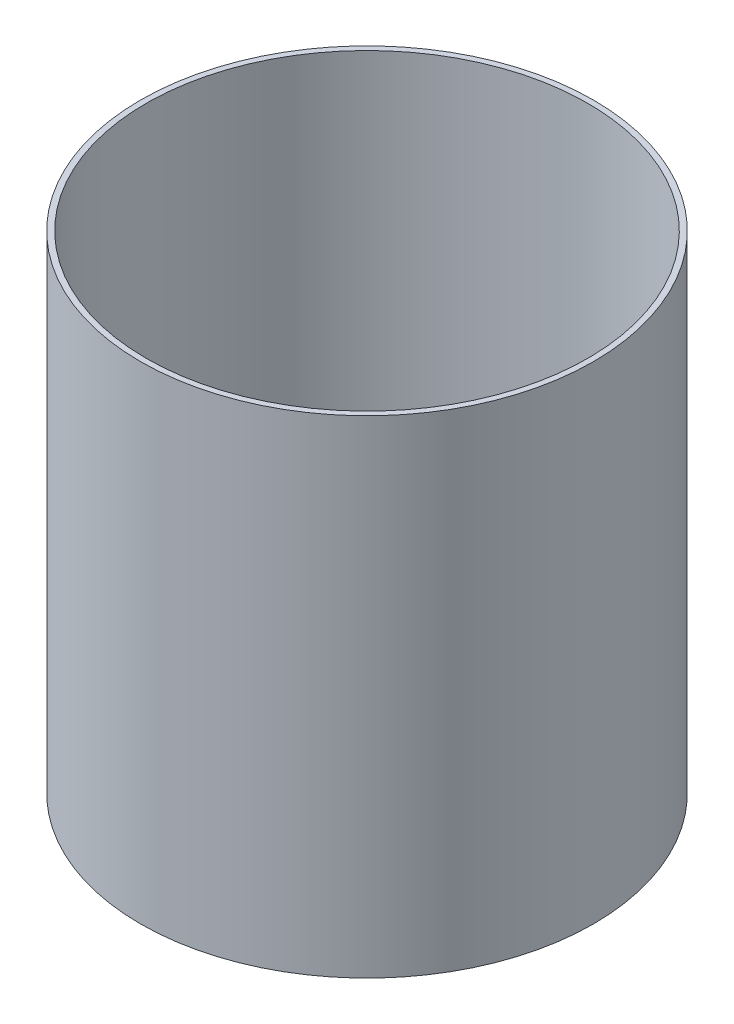
ISO-10303-21;
HEADER;
FILE_DESCRIPTION(('STEP AP214'),'2;1');
FILE_NAME('part.step','',(''),(''),'','','');
FILE_SCHEMA(('AUTOMOTIVE_DESIGN { 1 0 10303 214 1 1 1 1 }'));
ENDSEC;
DATA;
#1=APPLICATION_CONTEXT('core data for automotive mechanical design processes');
#2=APPLICATION_PROTOCOL_DEFINITION('international standard','automotive_design',2000,#1);
#3=PRODUCT_CONTEXT('',#1,'mechanical');
#4=PRODUCT('Part','Part','',(#3));
#5=PRODUCT_RELATED_PRODUCT_CATEGORY('part','',(#4));
#6=PRODUCT_DEFINITION_FORMATION('','',#4);
#7=PRODUCT_DEFINITION_CONTEXT('part definition',#1,'design');
#8=PRODUCT_DEFINITION('design','',#6,#7);
#9=PRODUCT_DEFINITION_SHAPE('','',#8);
#10=(LENGTH_UNIT() NAMED_UNIT(*) SI_UNIT(.MILLI.,.METRE.));
#11=(NAMED_UNIT(*) PLANE_ANGLE_UNIT() SI_UNIT($,.RADIAN.));
#12=(NAMED_UNIT(*) SI_UNIT($,.STERADIAN.) SOLID_ANGLE_UNIT());
#13=UNCERTAINTY_MEASURE_WITH_UNIT(LENGTH_MEASURE(1.E-05),#10,'distance_accuracy_value','');
#14=(GEOMETRIC_REPRESENTATION_CONTEXT(3) GLOBAL_UNCERTAINTY_ASSIGNED_CONTEXT((#13)) GLOBAL_UNIT_ASSIGNED_CONTEXT((#10,
#11,#12)) REPRESENTATION_CONTEXT('',''));
#15=CARTESIAN_POINT('',(0.,0.,0.));
#16=DIRECTION('',(0.,0.,1.));
#17=DIRECTION('',(1.,0.,0.));
#18=AXIS2_PLACEMENT_3D('',#15,#16,#17);
#19=CARTESIAN_POINT('',(0.,430.,0.));
#20=DIRECTION('',(0.,1.,0.));
#21=DIRECTION('',(0.,0.,1.));
#22=AXIS2_PLACEMENT_3D('',#19,#20,#21);
#23=PLANE('',#22);
#24=CARTESIAN_POINT('',(0.,430.,0.));
#25=DIRECTION('',(0.,1.,0.));
#26=DIRECTION('',(0.,0.,1.));
#27=AXIS2_PLACEMENT_3D('',#24,#25,#26);
#28=CIRCLE('',#27,200.);
#29=CARTESIAN_POINT('',(0.,430.,200.));
#30=VERTEX_POINT('',#29);
#31=EDGE_CURVE('E10',#30,#30,#28,.T.);
#32=ORIENTED_EDGE('',*,*,#31,.T.);
#33=EDGE_LOOP('',(#32));
#34=FACE_BOUND('',#33,.T.);
#35=CARTESIAN_POINT('',(0.,430.,0.));
#36=DIRECTION('',(0.,1.,0.));
#37=DIRECTION('',(0.,0.,1.));
#38=AXIS2_PLACEMENT_3D('',#35,#36,#37);
#39=CIRCLE('',#38,195.);
#40=CARTESIAN_POINT('',(0.,430.,195.));
#41=VERTEX_POINT('',#40);
#42=EDGE_CURVE('E52',#41,#41,#39,.T.);
#43=ORIENTED_EDGE('',*,*,#42,.F.);
#44=EDGE_LOOP('',(#43));
#45=FACE_BOUND('',#44,.T.);
#46=ADVANCED_FACE('F38',(#34,#45),#23,.T.);
#47=CARTESIAN_POINT('',(0.,0.,0.));
#48=DIRECTION('',(0.,1.,0.));
#49=DIRECTION('',(0.,0.,1.));
#50=AXIS2_PLACEMENT_3D('',#47,#48,#49);
#51=PLANE('',#50);
#52=CARTESIAN_POINT('',(0.,0.,0.));
#53=DIRECTION('',(0.,1.,0.));
#54=DIRECTION('',(0.,0.,1.));
#55=AXIS2_PLACEMENT_3D('',#52,#53,#54);
#56=CIRCLE('',#55,200.);
#57=CARTESIAN_POINT('',(0.,0.,200.));
#58=VERTEX_POINT('',#57);
#59=EDGE_CURVE('E42',#58,#58,#56,.T.);
#60=ORIENTED_EDGE('',*,*,#59,.F.);
#61=EDGE_LOOP('',(#60));
#62=FACE_BOUND('',#61,.T.);
#63=CARTESIAN_POINT('',(0.,0.,0.));
#64=DIRECTION('',(0.,1.,0.));
#65=DIRECTION('',(0.,0.,1.));
#66=AXIS2_PLACEMENT_3D('',#63,#64,#65);
#67=CIRCLE('',#66,195.);
#68=CARTESIAN_POINT('',(0.,0.,195.));
#69=VERTEX_POINT('',#68);
#70=EDGE_CURVE('E54',#69,#69,#67,.T.);
#71=ORIENTED_EDGE('',*,*,#70,.T.);
#72=EDGE_LOOP('',(#71));
#73=FACE_BOUND('',#72,.T.);
#74=ADVANCED_FACE('F65',(#62,#73),#51,.F.);
#75=CARTESIAN_POINT('',(0.,430.,0.));
#76=DIRECTION('',(0.,-1.,0.));
#77=DIRECTION('',(0.,0.,-1.));
#78=AXIS2_PLACEMENT_3D('',#75,#76,#77);
#79=CYLINDRICAL_SURFACE('',#78,200.);
#80=ORIENTED_EDGE('',*,*,#31,.F.);
#81=EDGE_LOOP('',(#80));
#82=FACE_BOUND('',#81,.T.);
#83=ORIENTED_EDGE('',*,*,#59,.T.);
#84=EDGE_LOOP('',(#83));
#85=FACE_BOUND('',#84,.T.);
#86=ADVANCED_FACE('F40',(#82,#85),#79,.T.);
#87=CARTESIAN_POINT('',(0.,430.,0.));
#88=DIRECTION('',(0.,-1.,0.));
#89=DIRECTION('',(0.,0.,-1.));
#90=AXIS2_PLACEMENT_3D('',#87,#88,#89);
#91=CYLINDRICAL_SURFACE('',#90,195.);
#92=ORIENTED_EDGE('',*,*,#42,.T.);
#93=EDGE_LOOP('',(#92));
#94=FACE_BOUND('',#93,.T.);
#95=ORIENTED_EDGE('',*,*,#70,.F.);
#96=EDGE_LOOP('',(#95));
#97=FACE_BOUND('',#96,.T.);
#98=ADVANCED_FACE('F61',(#94,#97),#91,.F.);
#99=CLOSED_SHELL('',(#46,#74,#86,#98));
#100=MANIFOLD_SOLID_BREP('B2',#99);
#101=ADVANCED_BREP_SHAPE_REPRESENTATION('',(#18,#100),#14);
#102=SHAPE_DEFINITION_REPRESENTATION(#9,#101);
ENDSEC;
END-ISO-10303-21;
